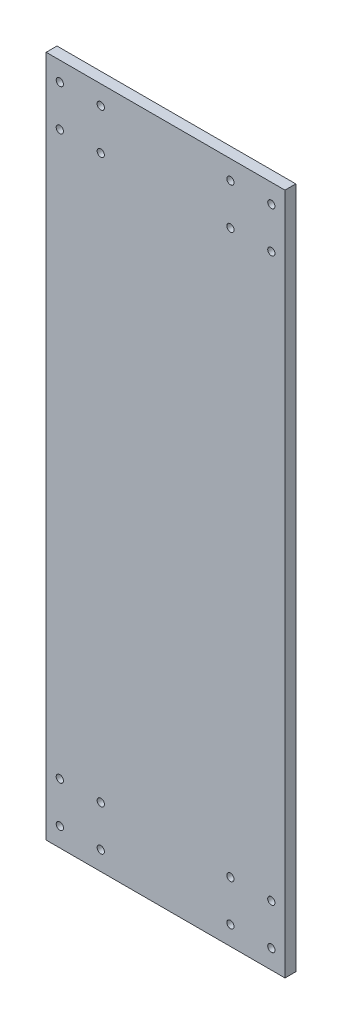
ISO-10303-21;
HEADER;
FILE_DESCRIPTION(('STEP AP214'),'2;1');
FILE_NAME('part.step','',(''),(''),'','','');
FILE_SCHEMA(('AUTOMOTIVE_DESIGN { 1 0 10303 214 1 1 1 1 }'));
ENDSEC;
DATA;
#1=APPLICATION_CONTEXT('core data for automotive mechanical design processes');
#2=APPLICATION_PROTOCOL_DEFINITION('international standard','automotive_design',2000,#1);
#3=PRODUCT_CONTEXT('',#1,'mechanical');
#4=PRODUCT('Part','Part','',(#3));
#5=PRODUCT_RELATED_PRODUCT_CATEGORY('part','',(#4));
#6=PRODUCT_DEFINITION_FORMATION('','',#4);
#7=PRODUCT_DEFINITION_CONTEXT('part definition',#1,'design');
#8=PRODUCT_DEFINITION('design','',#6,#7);
#9=PRODUCT_DEFINITION_SHAPE('','',#8);
#10=(LENGTH_UNIT() NAMED_UNIT(*) SI_UNIT(.MILLI.,.METRE.));
#11=(NAMED_UNIT(*) PLANE_ANGLE_UNIT() SI_UNIT($,.RADIAN.));
#12=(NAMED_UNIT(*) SI_UNIT($,.STERADIAN.) SOLID_ANGLE_UNIT());
#13=UNCERTAINTY_MEASURE_WITH_UNIT(LENGTH_MEASURE(1.E-05),#10,'distance_accuracy_value','');
#14=(GEOMETRIC_REPRESENTATION_CONTEXT(3) GLOBAL_UNCERTAINTY_ASSIGNED_CONTEXT((#13)) GLOBAL_UNIT_ASSIGNED_CONTEXT((#10,
#11,#12)) REPRESENTATION_CONTEXT('',''));
#15=CARTESIAN_POINT('',(0.,0.,0.));
#16=DIRECTION('',(0.,0.,1.));
#17=DIRECTION('',(1.,0.,0.));
#18=AXIS2_PLACEMENT_3D('',#15,#16,#17);
#19=CARTESIAN_POINT('',(0.,0.,6.35));
#20=DIRECTION('',(0.,0.,-1.));
#21=DIRECTION('',(-1.,0.,0.));
#22=AXIS2_PLACEMENT_3D('',#19,#20,#21);
#23=PLANE('',#22);
#24=DIRECTION('',(0.,1.,0.));
#25=VECTOR('',#24,1.);
#26=CARTESIAN_POINT('',(70.,-200.,6.35));
#27=LINE('',#26,#25);
#28=CARTESIAN_POINT('',(70.,-200.,6.35));
#29=VERTEX_POINT('',#28);
#30=CARTESIAN_POINT('',(70.,200.,6.35));
#31=VERTEX_POINT('',#30);
#32=EDGE_CURVE('E95',#29,#31,#27,.T.);
#33=ORIENTED_EDGE('',*,*,#32,.T.);
#34=DIRECTION('',(-1.,0.,0.));
#35=VECTOR('',#34,1.);
#36=CARTESIAN_POINT('',(-70.,200.,6.35));
#37=LINE('',#36,#35);
#38=CARTESIAN_POINT('',(-70.,200.,6.35));
#39=VERTEX_POINT('',#38);
#40=EDGE_CURVE('E90',#31,#39,#37,.T.);
#41=ORIENTED_EDGE('',*,*,#40,.T.);
#42=DIRECTION('',(0.,-1.,0.));
#43=VECTOR('',#42,1.);
#44=CARTESIAN_POINT('',(-70.,-200.,6.35));
#45=LINE('',#44,#43);
#46=CARTESIAN_POINT('',(-70.,-200.,6.35));
#47=VERTEX_POINT('',#46);
#48=EDGE_CURVE('E93',#39,#47,#45,.T.);
#49=ORIENTED_EDGE('',*,*,#48,.T.);
#50=DIRECTION('',(1.,0.,0.));
#51=VECTOR('',#50,1.);
#52=CARTESIAN_POINT('',(-70.,-200.,6.35));
#53=LINE('',#52,#51);
#54=EDGE_CURVE('E60',#47,#29,#53,.T.);
#55=ORIENTED_EDGE('',*,*,#54,.T.);
#56=EDGE_LOOP('',(#33,#41,#49,#55));
#57=FACE_BOUND('',#56,.T.);
#58=CARTESIAN_POINT('',(-62.,188.825,6.35));
#59=DIRECTION('',(0.,0.,1.));
#60=DIRECTION('',(1.,0.,0.));
#61=AXIS2_PLACEMENT_3D('',#58,#59,#60);
#62=CIRCLE('',#61,2.125);
#63=CARTESIAN_POINT('',(-59.875,188.825,6.35));
#64=VERTEX_POINT('',#63);
#65=EDGE_CURVE('E110',#64,#64,#62,.T.);
#66=ORIENTED_EDGE('',*,*,#65,.F.);
#67=EDGE_LOOP('',(#66));
#68=FACE_BOUND('',#67,.T.);
#69=CARTESIAN_POINT('',(-38.,188.825,6.35));
#70=DIRECTION('',(0.,0.,1.));
#71=DIRECTION('',(-1.,0.,0.));
#72=AXIS2_PLACEMENT_3D('',#69,#70,#71);
#73=CIRCLE('',#72,2.125);
#74=CARTESIAN_POINT('',(-40.125,188.825,6.35));
#75=VERTEX_POINT('',#74);
#76=EDGE_CURVE('E125',#75,#75,#73,.T.);
#77=ORIENTED_EDGE('',*,*,#76,.F.);
#78=EDGE_LOOP('',(#77));
#79=FACE_BOUND('',#78,.T.);
#80=CARTESIAN_POINT('',(-38.,164.825,6.35));
#81=DIRECTION('',(0.,0.,1.));
#82=DIRECTION('',(1.,0.,0.));
#83=AXIS2_PLACEMENT_3D('',#80,#81,#82);
#84=CIRCLE('',#83,2.125);
#85=CARTESIAN_POINT('',(-35.875,164.825,6.35));
#86=VERTEX_POINT('',#85);
#87=EDGE_CURVE('E131',#86,#86,#84,.T.);
#88=ORIENTED_EDGE('',*,*,#87,.F.);
#89=EDGE_LOOP('',(#88));
#90=FACE_BOUND('',#89,.T.);
#91=CARTESIAN_POINT('',(-62.,164.825,6.35));
#92=DIRECTION('',(0.,0.,1.));
#93=DIRECTION('',(-1.,0.,0.));
#94=AXIS2_PLACEMENT_3D('',#91,#92,#93);
#95=CIRCLE('',#94,2.125);
#96=CARTESIAN_POINT('',(-64.125,164.825,6.35));
#97=VERTEX_POINT('',#96);
#98=EDGE_CURVE('E137',#97,#97,#95,.T.);
#99=ORIENTED_EDGE('',*,*,#98,.F.);
#100=EDGE_LOOP('',(#99));
#101=FACE_BOUND('',#100,.T.);
#102=CARTESIAN_POINT('',(38.,164.825,6.35));
#103=DIRECTION('',(0.,0.,1.));
#104=DIRECTION('',(-1.,0.,0.));
#105=AXIS2_PLACEMENT_3D('',#102,#103,#104);
#106=CIRCLE('',#105,2.125);
#107=CARTESIAN_POINT('',(35.875,164.825,6.35));
#108=VERTEX_POINT('',#107);
#109=EDGE_CURVE('E143',#108,#108,#106,.T.);
#110=ORIENTED_EDGE('',*,*,#109,.F.);
#111=EDGE_LOOP('',(#110));
#112=FACE_BOUND('',#111,.T.);
#113=CARTESIAN_POINT('',(62.,164.825,6.35));
#114=DIRECTION('',(0.,0.,1.));
#115=DIRECTION('',(1.,0.,0.));
#116=AXIS2_PLACEMENT_3D('',#113,#114,#115);
#117=CIRCLE('',#116,2.12500000000001);
#118=CARTESIAN_POINT('',(64.125,164.825,6.35));
#119=VERTEX_POINT('',#118);
#120=EDGE_CURVE('E149',#119,#119,#117,.T.);
#121=ORIENTED_EDGE('',*,*,#120,.F.);
#122=EDGE_LOOP('',(#121));
#123=FACE_BOUND('',#122,.T.);
#124=CARTESIAN_POINT('',(38.,188.825,6.35));
#125=DIRECTION('',(0.,0.,1.));
#126=DIRECTION('',(1.,0.,0.));
#127=AXIS2_PLACEMENT_3D('',#124,#125,#126);
#128=CIRCLE('',#127,2.125);
#129=CARTESIAN_POINT('',(40.125,188.825,6.35));
#130=VERTEX_POINT('',#129);
#131=EDGE_CURVE('E155',#130,#130,#128,.T.);
#132=ORIENTED_EDGE('',*,*,#131,.F.);
#133=EDGE_LOOP('',(#132));
#134=FACE_BOUND('',#133,.T.);
#135=CARTESIAN_POINT('',(62.,188.825,6.35));
#136=DIRECTION('',(0.,0.,1.));
#137=DIRECTION('',(-1.,0.,0.));
#138=AXIS2_PLACEMENT_3D('',#135,#136,#137);
#139=CIRCLE('',#138,2.12500000000001);
#140=CARTESIAN_POINT('',(59.875,188.825,6.35));
#141=VERTEX_POINT('',#140);
#142=EDGE_CURVE('E161',#141,#141,#139,.T.);
#143=ORIENTED_EDGE('',*,*,#142,.F.);
#144=EDGE_LOOP('',(#143));
#145=FACE_BOUND('',#144,.T.);
#146=CARTESIAN_POINT('',(62.,-188.825,6.35));
#147=DIRECTION('',(0.,0.,1.));
#148=DIRECTION('',(1.,0.,0.));
#149=AXIS2_PLACEMENT_3D('',#146,#147,#148);
#150=CIRCLE('',#149,2.12500000000001);
#151=CARTESIAN_POINT('',(64.125,-188.825,6.35));
#152=VERTEX_POINT('',#151);
#153=EDGE_CURVE('E167',#152,#152,#150,.T.);
#154=ORIENTED_EDGE('',*,*,#153,.F.);
#155=EDGE_LOOP('',(#154));
#156=FACE_BOUND('',#155,.T.);
#157=CARTESIAN_POINT('',(38.,-188.825,6.35));
#158=DIRECTION('',(0.,0.,1.));
#159=DIRECTION('',(-1.,0.,0.));
#160=AXIS2_PLACEMENT_3D('',#157,#158,#159);
#161=CIRCLE('',#160,2.125);
#162=CARTESIAN_POINT('',(35.875,-188.825,6.35));
#163=VERTEX_POINT('',#162);
#164=EDGE_CURVE('E173',#163,#163,#161,.T.);
#165=ORIENTED_EDGE('',*,*,#164,.F.);
#166=EDGE_LOOP('',(#165));
#167=FACE_BOUND('',#166,.T.);
#168=CARTESIAN_POINT('',(62.,-164.825,6.35));
#169=DIRECTION('',(0.,0.,1.));
#170=DIRECTION('',(-1.,0.,0.));
#171=AXIS2_PLACEMENT_3D('',#168,#169,#170);
#172=CIRCLE('',#171,2.12500000000001);
#173=CARTESIAN_POINT('',(59.875,-164.825,6.35));
#174=VERTEX_POINT('',#173);
#175=EDGE_CURVE('E179',#174,#174,#172,.T.);
#176=ORIENTED_EDGE('',*,*,#175,.F.);
#177=EDGE_LOOP('',(#176));
#178=FACE_BOUND('',#177,.T.);
#179=CARTESIAN_POINT('',(38.,-164.825,6.35));
#180=DIRECTION('',(0.,0.,1.));
#181=DIRECTION('',(1.,0.,0.));
#182=AXIS2_PLACEMENT_3D('',#179,#180,#181);
#183=CIRCLE('',#182,2.125);
#184=CARTESIAN_POINT('',(40.125,-164.825,6.35));
#185=VERTEX_POINT('',#184);
#186=EDGE_CURVE('E185',#185,#185,#183,.T.);
#187=ORIENTED_EDGE('',*,*,#186,.F.);
#188=EDGE_LOOP('',(#187));
#189=FACE_BOUND('',#188,.T.);
#190=CARTESIAN_POINT('',(-62.,-164.825,6.35));
#191=DIRECTION('',(0.,0.,1.));
#192=DIRECTION('',(1.,0.,0.));
#193=AXIS2_PLACEMENT_3D('',#190,#191,#192);
#194=CIRCLE('',#193,2.125);
#195=CARTESIAN_POINT('',(-59.875,-164.825,6.35));
#196=VERTEX_POINT('',#195);
#197=EDGE_CURVE('E191',#196,#196,#194,.T.);
#198=ORIENTED_EDGE('',*,*,#197,.F.);
#199=EDGE_LOOP('',(#198));
#200=FACE_BOUND('',#199,.T.);
#201=CARTESIAN_POINT('',(-38.,-164.825,6.35));
#202=DIRECTION('',(0.,0.,1.));
#203=DIRECTION('',(-1.,0.,0.));
#204=AXIS2_PLACEMENT_3D('',#201,#202,#203);
#205=CIRCLE('',#204,2.125);
#206=CARTESIAN_POINT('',(-40.125,-164.825,6.35));
#207=VERTEX_POINT('',#206);
#208=EDGE_CURVE('E197',#207,#207,#205,.T.);
#209=ORIENTED_EDGE('',*,*,#208,.F.);
#210=EDGE_LOOP('',(#209));
#211=FACE_BOUND('',#210,.T.);
#212=CARTESIAN_POINT('',(-38.,-188.825,6.35));
#213=DIRECTION('',(0.,0.,1.));
#214=DIRECTION('',(1.,0.,0.));
#215=AXIS2_PLACEMENT_3D('',#212,#213,#214);
#216=CIRCLE('',#215,2.125);
#217=CARTESIAN_POINT('',(-35.875,-188.825,6.35));
#218=VERTEX_POINT('',#217);
#219=EDGE_CURVE('E203',#218,#218,#216,.T.);
#220=ORIENTED_EDGE('',*,*,#219,.F.);
#221=EDGE_LOOP('',(#220));
#222=FACE_BOUND('',#221,.T.);
#223=CARTESIAN_POINT('',(-62.,-188.825,6.35));
#224=DIRECTION('',(0.,0.,1.));
#225=DIRECTION('',(-1.,0.,0.));
#226=AXIS2_PLACEMENT_3D('',#223,#224,#225);
#227=CIRCLE('',#226,2.125);
#228=CARTESIAN_POINT('',(-64.125,-188.825,6.35));
#229=VERTEX_POINT('',#228);
#230=EDGE_CURVE('E209',#229,#229,#227,.T.);
#231=ORIENTED_EDGE('',*,*,#230,.F.);
#232=EDGE_LOOP('',(#231));
#233=FACE_BOUND('',#232,.T.);
#234=ADVANCED_FACE('F43',(#57,#68,#79,#90,#101,#112,#123,#134,#145,#156,#167,#178,#189,#200,
#211,#222,#233),#23,.F.);
#235=CARTESIAN_POINT('',(0.,0.,0.));
#236=DIRECTION('',(0.,0.,-1.));
#237=DIRECTION('',(-1.,0.,0.));
#238=AXIS2_PLACEMENT_3D('',#235,#236,#237);
#239=PLANE('',#238);
#240=CARTESIAN_POINT('',(-38.,-188.825,0.));
#241=DIRECTION('',(0.,0.,1.));
#242=DIRECTION('',(1.,0.,0.));
#243=AXIS2_PLACEMENT_3D('',#240,#241,#242);
#244=CIRCLE('',#243,2.125);
#245=CARTESIAN_POINT('',(-35.875,-188.825,0.));
#246=VERTEX_POINT('',#245);
#247=EDGE_CURVE('E206',#246,#246,#244,.T.);
#248=ORIENTED_EDGE('',*,*,#247,.T.);
#249=EDGE_LOOP('',(#248));
#250=FACE_BOUND('',#249,.T.);
#251=CARTESIAN_POINT('',(-62.,-164.825,0.));
#252=DIRECTION('',(0.,0.,1.));
#253=DIRECTION('',(1.,0.,0.));
#254=AXIS2_PLACEMENT_3D('',#251,#252,#253);
#255=CIRCLE('',#254,2.125);
#256=CARTESIAN_POINT('',(-59.875,-164.825,0.));
#257=VERTEX_POINT('',#256);
#258=EDGE_CURVE('E194',#257,#257,#255,.T.);
#259=ORIENTED_EDGE('',*,*,#258,.T.);
#260=EDGE_LOOP('',(#259));
#261=FACE_BOUND('',#260,.T.);
#262=CARTESIAN_POINT('',(62.,-164.825,0.));
#263=DIRECTION('',(0.,0.,1.));
#264=DIRECTION('',(-1.,0.,0.));
#265=AXIS2_PLACEMENT_3D('',#262,#263,#264);
#266=CIRCLE('',#265,2.12500000000001);
#267=CARTESIAN_POINT('',(59.875,-164.825,0.));
#268=VERTEX_POINT('',#267);
#269=EDGE_CURVE('E182',#268,#268,#266,.T.);
#270=ORIENTED_EDGE('',*,*,#269,.T.);
#271=EDGE_LOOP('',(#270));
#272=FACE_BOUND('',#271,.T.);
#273=CARTESIAN_POINT('',(62.,-188.825,0.));
#274=DIRECTION('',(0.,0.,1.));
#275=DIRECTION('',(1.,0.,0.));
#276=AXIS2_PLACEMENT_3D('',#273,#274,#275);
#277=CIRCLE('',#276,2.12500000000001);
#278=CARTESIAN_POINT('',(64.125,-188.825,0.));
#279=VERTEX_POINT('',#278);
#280=EDGE_CURVE('E170',#279,#279,#277,.T.);
#281=ORIENTED_EDGE('',*,*,#280,.T.);
#282=EDGE_LOOP('',(#281));
#283=FACE_BOUND('',#282,.T.);
#284=CARTESIAN_POINT('',(38.,188.825,0.));
#285=DIRECTION('',(0.,0.,1.));
#286=DIRECTION('',(1.,0.,0.));
#287=AXIS2_PLACEMENT_3D('',#284,#285,#286);
#288=CIRCLE('',#287,2.125);
#289=CARTESIAN_POINT('',(40.125,188.825,0.));
#290=VERTEX_POINT('',#289);
#291=EDGE_CURVE('E158',#290,#290,#288,.T.);
#292=ORIENTED_EDGE('',*,*,#291,.T.);
#293=EDGE_LOOP('',(#292));
#294=FACE_BOUND('',#293,.T.);
#295=CARTESIAN_POINT('',(38.,164.825,0.));
#296=DIRECTION('',(0.,0.,1.));
#297=DIRECTION('',(-1.,0.,0.));
#298=AXIS2_PLACEMENT_3D('',#295,#296,#297);
#299=CIRCLE('',#298,2.125);
#300=CARTESIAN_POINT('',(35.875,164.825,0.));
#301=VERTEX_POINT('',#300);
#302=EDGE_CURVE('E146',#301,#301,#299,.T.);
#303=ORIENTED_EDGE('',*,*,#302,.T.);
#304=EDGE_LOOP('',(#303));
#305=FACE_BOUND('',#304,.T.);
#306=CARTESIAN_POINT('',(-38.,164.825,0.));
#307=DIRECTION('',(0.,0.,1.));
#308=DIRECTION('',(1.,0.,0.));
#309=AXIS2_PLACEMENT_3D('',#306,#307,#308);
#310=CIRCLE('',#309,2.125);
#311=CARTESIAN_POINT('',(-35.875,164.825,0.));
#312=VERTEX_POINT('',#311);
#313=EDGE_CURVE('E134',#312,#312,#310,.T.);
#314=ORIENTED_EDGE('',*,*,#313,.T.);
#315=EDGE_LOOP('',(#314));
#316=FACE_BOUND('',#315,.T.);
#317=CARTESIAN_POINT('',(-62.,188.825,0.));
#318=DIRECTION('',(0.,0.,1.));
#319=DIRECTION('',(1.,0.,0.));
#320=AXIS2_PLACEMENT_3D('',#317,#318,#319);
#321=CIRCLE('',#320,2.125);
#322=CARTESIAN_POINT('',(-59.875,188.825,0.));
#323=VERTEX_POINT('',#322);
#324=EDGE_CURVE('E122',#323,#323,#321,.T.);
#325=ORIENTED_EDGE('',*,*,#324,.T.);
#326=EDGE_LOOP('',(#325));
#327=FACE_BOUND('',#326,.T.);
#328=DIRECTION('',(0.,1.,0.));
#329=VECTOR('',#328,1.);
#330=CARTESIAN_POINT('',(70.,-200.,0.));
#331=LINE('',#330,#329);
#332=CARTESIAN_POINT('',(70.,-200.,0.));
#333=VERTEX_POINT('',#332);
#334=CARTESIAN_POINT('',(70.,200.,0.));
#335=VERTEX_POINT('',#334);
#336=EDGE_CURVE('E107',#333,#335,#331,.T.);
#337=ORIENTED_EDGE('',*,*,#336,.F.);
#338=DIRECTION('',(1.,0.,0.));
#339=VECTOR('',#338,1.);
#340=CARTESIAN_POINT('',(-70.,-200.,0.));
#341=LINE('',#340,#339);
#342=CARTESIAN_POINT('',(-70.,-200.,0.));
#343=VERTEX_POINT('',#342);
#344=EDGE_CURVE('E83',#343,#333,#341,.T.);
#345=ORIENTED_EDGE('',*,*,#344,.F.);
#346=DIRECTION('',(0.,-1.,0.));
#347=VECTOR('',#346,1.);
#348=CARTESIAN_POINT('',(-70.,-200.,0.));
#349=LINE('',#348,#347);
#350=CARTESIAN_POINT('',(-70.,200.,0.));
#351=VERTEX_POINT('',#350);
#352=EDGE_CURVE('E77',#351,#343,#349,.T.);
#353=ORIENTED_EDGE('',*,*,#352,.F.);
#354=DIRECTION('',(-1.,0.,0.));
#355=VECTOR('',#354,1.);
#356=CARTESIAN_POINT('',(-70.,200.,0.));
#357=LINE('',#356,#355);
#358=EDGE_CURVE('E99',#335,#351,#357,.T.);
#359=ORIENTED_EDGE('',*,*,#358,.F.);
#360=EDGE_LOOP('',(#337,#345,#353,#359));
#361=FACE_BOUND('',#360,.T.);
#362=CARTESIAN_POINT('',(-38.,188.825,0.));
#363=DIRECTION('',(0.,0.,1.));
#364=DIRECTION('',(-1.,0.,0.));
#365=AXIS2_PLACEMENT_3D('',#362,#363,#364);
#366=CIRCLE('',#365,2.125);
#367=CARTESIAN_POINT('',(-40.125,188.825,0.));
#368=VERTEX_POINT('',#367);
#369=EDGE_CURVE('E128',#368,#368,#366,.T.);
#370=ORIENTED_EDGE('',*,*,#369,.T.);
#371=EDGE_LOOP('',(#370));
#372=FACE_BOUND('',#371,.T.);
#373=CARTESIAN_POINT('',(-62.,164.825,0.));
#374=DIRECTION('',(0.,0.,1.));
#375=DIRECTION('',(-1.,0.,0.));
#376=AXIS2_PLACEMENT_3D('',#373,#374,#375);
#377=CIRCLE('',#376,2.125);
#378=CARTESIAN_POINT('',(-64.125,164.825,0.));
#379=VERTEX_POINT('',#378);
#380=EDGE_CURVE('E140',#379,#379,#377,.T.);
#381=ORIENTED_EDGE('',*,*,#380,.T.);
#382=EDGE_LOOP('',(#381));
#383=FACE_BOUND('',#382,.T.);
#384=CARTESIAN_POINT('',(62.,164.825,0.));
#385=DIRECTION('',(0.,0.,1.));
#386=DIRECTION('',(1.,0.,0.));
#387=AXIS2_PLACEMENT_3D('',#384,#385,#386);
#388=CIRCLE('',#387,2.12500000000001);
#389=CARTESIAN_POINT('',(64.125,164.825,0.));
#390=VERTEX_POINT('',#389);
#391=EDGE_CURVE('E152',#390,#390,#388,.T.);
#392=ORIENTED_EDGE('',*,*,#391,.T.);
#393=EDGE_LOOP('',(#392));
#394=FACE_BOUND('',#393,.T.);
#395=CARTESIAN_POINT('',(62.,188.825,0.));
#396=DIRECTION('',(0.,0.,1.));
#397=DIRECTION('',(-1.,0.,0.));
#398=AXIS2_PLACEMENT_3D('',#395,#396,#397);
#399=CIRCLE('',#398,2.12500000000001);
#400=CARTESIAN_POINT('',(59.875,188.825,0.));
#401=VERTEX_POINT('',#400);
#402=EDGE_CURVE('E164',#401,#401,#399,.T.);
#403=ORIENTED_EDGE('',*,*,#402,.T.);
#404=EDGE_LOOP('',(#403));
#405=FACE_BOUND('',#404,.T.);
#406=CARTESIAN_POINT('',(38.,-188.825,0.));
#407=DIRECTION('',(0.,0.,1.));
#408=DIRECTION('',(-1.,0.,0.));
#409=AXIS2_PLACEMENT_3D('',#406,#407,#408);
#410=CIRCLE('',#409,2.125);
#411=CARTESIAN_POINT('',(35.875,-188.825,0.));
#412=VERTEX_POINT('',#411);
#413=EDGE_CURVE('E176',#412,#412,#410,.T.);
#414=ORIENTED_EDGE('',*,*,#413,.T.);
#415=EDGE_LOOP('',(#414));
#416=FACE_BOUND('',#415,.T.);
#417=CARTESIAN_POINT('',(38.,-164.825,0.));
#418=DIRECTION('',(0.,0.,1.));
#419=DIRECTION('',(1.,0.,0.));
#420=AXIS2_PLACEMENT_3D('',#417,#418,#419);
#421=CIRCLE('',#420,2.125);
#422=CARTESIAN_POINT('',(40.125,-164.825,0.));
#423=VERTEX_POINT('',#422);
#424=EDGE_CURVE('E188',#423,#423,#421,.T.);
#425=ORIENTED_EDGE('',*,*,#424,.T.);
#426=EDGE_LOOP('',(#425));
#427=FACE_BOUND('',#426,.T.);
#428=CARTESIAN_POINT('',(-38.,-164.825,0.));
#429=DIRECTION('',(0.,0.,1.));
#430=DIRECTION('',(-1.,0.,0.));
#431=AXIS2_PLACEMENT_3D('',#428,#429,#430);
#432=CIRCLE('',#431,2.125);
#433=CARTESIAN_POINT('',(-40.125,-164.825,0.));
#434=VERTEX_POINT('',#433);
#435=EDGE_CURVE('E200',#434,#434,#432,.T.);
#436=ORIENTED_EDGE('',*,*,#435,.T.);
#437=EDGE_LOOP('',(#436));
#438=FACE_BOUND('',#437,.T.);
#439=CARTESIAN_POINT('',(-62.,-188.825,0.));
#440=DIRECTION('',(0.,0.,1.));
#441=DIRECTION('',(-1.,0.,0.));
#442=AXIS2_PLACEMENT_3D('',#439,#440,#441);
#443=CIRCLE('',#442,2.125);
#444=CARTESIAN_POINT('',(-64.125,-188.825,0.));
#445=VERTEX_POINT('',#444);
#446=EDGE_CURVE('E212',#445,#445,#443,.T.);
#447=ORIENTED_EDGE('',*,*,#446,.T.);
#448=EDGE_LOOP('',(#447));
#449=FACE_BOUND('',#448,.T.);
#450=ADVANCED_FACE('F118',(#250,#261,#272,#283,#294,#305,#316,#327,#361,#372,#383,#394,#405,
#416,#427,#438,#449),#239,.T.);
#451=CARTESIAN_POINT('',(70.,-200.,6.35));
#452=DIRECTION('',(-1.,0.,0.));
#453=DIRECTION('',(0.,0.,1.));
#454=AXIS2_PLACEMENT_3D('',#451,#452,#453);
#455=PLANE('',#454);
#456=ORIENTED_EDGE('',*,*,#336,.T.);
#457=DIRECTION('',(0.,0.,-1.));
#458=VECTOR('',#457,1.);
#459=CARTESIAN_POINT('',(70.,200.,6.35));
#460=LINE('',#459,#458);
#461=EDGE_CURVE('E11',#31,#335,#460,.T.);
#462=ORIENTED_EDGE('',*,*,#461,.F.);
#463=ORIENTED_EDGE('',*,*,#32,.F.);
#464=DIRECTION('',(0.,0.,-1.));
#465=VECTOR('',#464,1.);
#466=CARTESIAN_POINT('',(70.,-200.,6.35));
#467=LINE('',#466,#465);
#468=EDGE_CURVE('E103',#29,#333,#467,.T.);
#469=ORIENTED_EDGE('',*,*,#468,.T.);
#470=EDGE_LOOP('',(#456,#462,#463,#469));
#471=FACE_BOUND('',#470,.T.);
#472=ADVANCED_FACE('F45',(#471),#455,.F.);
#473=CARTESIAN_POINT('',(-70.,200.,6.35));
#474=DIRECTION('',(0.,-1.,0.));
#475=DIRECTION('',(0.,0.,-1.));
#476=AXIS2_PLACEMENT_3D('',#473,#474,#475);
#477=PLANE('',#476);
#478=ORIENTED_EDGE('',*,*,#358,.T.);
#479=DIRECTION('',(0.,0.,-1.));
#480=VECTOR('',#479,1.);
#481=CARTESIAN_POINT('',(-70.,200.,6.35));
#482=LINE('',#481,#480);
#483=EDGE_CURVE('E52',#39,#351,#482,.T.);
#484=ORIENTED_EDGE('',*,*,#483,.F.);
#485=ORIENTED_EDGE('',*,*,#40,.F.);
#486=ORIENTED_EDGE('',*,*,#461,.T.);
#487=EDGE_LOOP('',(#478,#484,#485,#486));
#488=FACE_BOUND('',#487,.T.);
#489=ADVANCED_FACE('F98',(#488),#477,.F.);
#490=CARTESIAN_POINT('',(-70.,-200.,6.35));
#491=DIRECTION('',(1.,0.,0.));
#492=DIRECTION('',(0.,0.,-1.));
#493=AXIS2_PLACEMENT_3D('',#490,#491,#492);
#494=PLANE('',#493);
#495=ORIENTED_EDGE('',*,*,#352,.T.);
#496=DIRECTION('',(0.,0.,-1.));
#497=VECTOR('',#496,1.);
#498=CARTESIAN_POINT('',(-70.,-200.,6.35));
#499=LINE('',#498,#497);
#500=EDGE_CURVE('E100',#47,#343,#499,.T.);
#501=ORIENTED_EDGE('',*,*,#500,.F.);
#502=ORIENTED_EDGE('',*,*,#48,.F.);
#503=ORIENTED_EDGE('',*,*,#483,.T.);
#504=EDGE_LOOP('',(#495,#501,#502,#503));
#505=FACE_BOUND('',#504,.T.);
#506=ADVANCED_FACE('F101',(#505),#494,.F.);
#507=CARTESIAN_POINT('',(-70.,-200.,6.35));
#508=DIRECTION('',(0.,1.,0.));
#509=DIRECTION('',(0.,0.,1.));
#510=AXIS2_PLACEMENT_3D('',#507,#508,#509);
#511=PLANE('',#510);
#512=ORIENTED_EDGE('',*,*,#344,.T.);
#513=ORIENTED_EDGE('',*,*,#468,.F.);
#514=ORIENTED_EDGE('',*,*,#54,.F.);
#515=ORIENTED_EDGE('',*,*,#500,.T.);
#516=EDGE_LOOP('',(#512,#513,#514,#515));
#517=FACE_BOUND('',#516,.T.);
#518=ADVANCED_FACE('F115',(#517),#511,.F.);
#519=CARTESIAN_POINT('',(-62.,188.825,6.35));
#520=DIRECTION('',(0.,0.,-1.));
#521=DIRECTION('',(-1.,0.,0.));
#522=AXIS2_PLACEMENT_3D('',#519,#520,#521);
#523=CYLINDRICAL_SURFACE('',#522,2.125);
#524=ORIENTED_EDGE('',*,*,#65,.T.);
#525=EDGE_LOOP('',(#524));
#526=FACE_BOUND('',#525,.T.);
#527=ORIENTED_EDGE('',*,*,#324,.F.);
#528=EDGE_LOOP('',(#527));
#529=FACE_BOUND('',#528,.T.);
#530=ADVANCED_FACE('F229',(#526,#529),#523,.F.);
#531=CARTESIAN_POINT('',(-38.,188.825,6.35));
#532=DIRECTION('',(0.,0.,-1.));
#533=DIRECTION('',(-1.,0.,0.));
#534=AXIS2_PLACEMENT_3D('',#531,#532,#533);
#535=CYLINDRICAL_SURFACE('',#534,2.125);
#536=ORIENTED_EDGE('',*,*,#76,.T.);
#537=EDGE_LOOP('',(#536));
#538=FACE_BOUND('',#537,.T.);
#539=ORIENTED_EDGE('',*,*,#369,.F.);
#540=EDGE_LOOP('',(#539));
#541=FACE_BOUND('',#540,.T.);
#542=ADVANCED_FACE('F274',(#538,#541),#535,.F.);
#543=CARTESIAN_POINT('',(-38.,164.825,6.35));
#544=DIRECTION('',(0.,0.,-1.));
#545=DIRECTION('',(-1.,0.,0.));
#546=AXIS2_PLACEMENT_3D('',#543,#544,#545);
#547=CYLINDRICAL_SURFACE('',#546,2.125);
#548=ORIENTED_EDGE('',*,*,#87,.T.);
#549=EDGE_LOOP('',(#548));
#550=FACE_BOUND('',#549,.T.);
#551=ORIENTED_EDGE('',*,*,#313,.F.);
#552=EDGE_LOOP('',(#551));
#553=FACE_BOUND('',#552,.T.);
#554=ADVANCED_FACE('F282',(#550,#553),#547,.F.);
#555=CARTESIAN_POINT('',(-62.,164.825,6.35));
#556=DIRECTION('',(0.,0.,-1.));
#557=DIRECTION('',(-1.,0.,0.));
#558=AXIS2_PLACEMENT_3D('',#555,#556,#557);
#559=CYLINDRICAL_SURFACE('',#558,2.125);
#560=ORIENTED_EDGE('',*,*,#98,.T.);
#561=EDGE_LOOP('',(#560));
#562=FACE_BOUND('',#561,.T.);
#563=ORIENTED_EDGE('',*,*,#380,.F.);
#564=EDGE_LOOP('',(#563));
#565=FACE_BOUND('',#564,.T.);
#566=ADVANCED_FACE('F290',(#562,#565),#559,.F.);
#567=CARTESIAN_POINT('',(38.,164.825,6.35));
#568=DIRECTION('',(0.,0.,-1.));
#569=DIRECTION('',(-1.,0.,0.));
#570=AXIS2_PLACEMENT_3D('',#567,#568,#569);
#571=CYLINDRICAL_SURFACE('',#570,2.125);
#572=ORIENTED_EDGE('',*,*,#109,.T.);
#573=EDGE_LOOP('',(#572));
#574=FACE_BOUND('',#573,.T.);
#575=ORIENTED_EDGE('',*,*,#302,.F.);
#576=EDGE_LOOP('',(#575));
#577=FACE_BOUND('',#576,.T.);
#578=ADVANCED_FACE('F299',(#574,#577),#571,.F.);
#579=CARTESIAN_POINT('',(62.,164.825,6.35));
#580=DIRECTION('',(0.,0.,-1.));
#581=DIRECTION('',(-1.,0.,0.));
#582=AXIS2_PLACEMENT_3D('',#579,#580,#581);
#583=CYLINDRICAL_SURFACE('',#582,2.12500000000001);
#584=ORIENTED_EDGE('',*,*,#120,.T.);
#585=EDGE_LOOP('',(#584));
#586=FACE_BOUND('',#585,.T.);
#587=ORIENTED_EDGE('',*,*,#391,.F.);
#588=EDGE_LOOP('',(#587));
#589=FACE_BOUND('',#588,.T.);
#590=ADVANCED_FACE('F308',(#586,#589),#583,.F.);
#591=CARTESIAN_POINT('',(38.,188.825,6.35));
#592=DIRECTION('',(0.,0.,-1.));
#593=DIRECTION('',(-1.,0.,0.));
#594=AXIS2_PLACEMENT_3D('',#591,#592,#593);
#595=CYLINDRICAL_SURFACE('',#594,2.125);
#596=ORIENTED_EDGE('',*,*,#131,.T.);
#597=EDGE_LOOP('',(#596));
#598=FACE_BOUND('',#597,.T.);
#599=ORIENTED_EDGE('',*,*,#291,.F.);
#600=EDGE_LOOP('',(#599));
#601=FACE_BOUND('',#600,.T.);
#602=ADVANCED_FACE('F317',(#598,#601),#595,.F.);
#603=CARTESIAN_POINT('',(62.,188.825,6.35));
#604=DIRECTION('',(0.,0.,-1.));
#605=DIRECTION('',(-1.,0.,0.));
#606=AXIS2_PLACEMENT_3D('',#603,#604,#605);
#607=CYLINDRICAL_SURFACE('',#606,2.12500000000001);
#608=ORIENTED_EDGE('',*,*,#142,.T.);
#609=EDGE_LOOP('',(#608));
#610=FACE_BOUND('',#609,.T.);
#611=ORIENTED_EDGE('',*,*,#402,.F.);
#612=EDGE_LOOP('',(#611));
#613=FACE_BOUND('',#612,.T.);
#614=ADVANCED_FACE('F326',(#610,#613),#607,.F.);
#615=CARTESIAN_POINT('',(62.,-188.825,6.35));
#616=DIRECTION('',(0.,0.,-1.));
#617=DIRECTION('',(-1.,0.,0.));
#618=AXIS2_PLACEMENT_3D('',#615,#616,#617);
#619=CYLINDRICAL_SURFACE('',#618,2.12500000000001);
#620=ORIENTED_EDGE('',*,*,#153,.T.);
#621=EDGE_LOOP('',(#620));
#622=FACE_BOUND('',#621,.T.);
#623=ORIENTED_EDGE('',*,*,#280,.F.);
#624=EDGE_LOOP('',(#623));
#625=FACE_BOUND('',#624,.T.);
#626=ADVANCED_FACE('F335',(#622,#625),#619,.F.);
#627=CARTESIAN_POINT('',(38.,-188.825,6.35));
#628=DIRECTION('',(0.,0.,-1.));
#629=DIRECTION('',(-1.,0.,0.));
#630=AXIS2_PLACEMENT_3D('',#627,#628,#629);
#631=CYLINDRICAL_SURFACE('',#630,2.125);
#632=ORIENTED_EDGE('',*,*,#164,.T.);
#633=EDGE_LOOP('',(#632));
#634=FACE_BOUND('',#633,.T.);
#635=ORIENTED_EDGE('',*,*,#413,.F.);
#636=EDGE_LOOP('',(#635));
#637=FACE_BOUND('',#636,.T.);
#638=ADVANCED_FACE('F344',(#634,#637),#631,.F.);
#639=CARTESIAN_POINT('',(62.,-164.825,6.35));
#640=DIRECTION('',(0.,0.,-1.));
#641=DIRECTION('',(-1.,0.,0.));
#642=AXIS2_PLACEMENT_3D('',#639,#640,#641);
#643=CYLINDRICAL_SURFACE('',#642,2.12500000000001);
#644=ORIENTED_EDGE('',*,*,#175,.T.);
#645=EDGE_LOOP('',(#644));
#646=FACE_BOUND('',#645,.T.);
#647=ORIENTED_EDGE('',*,*,#269,.F.);
#648=EDGE_LOOP('',(#647));
#649=FACE_BOUND('',#648,.T.);
#650=ADVANCED_FACE('F353',(#646,#649),#643,.F.);
#651=CARTESIAN_POINT('',(38.,-164.825,6.35));
#652=DIRECTION('',(0.,0.,-1.));
#653=DIRECTION('',(-1.,0.,0.));
#654=AXIS2_PLACEMENT_3D('',#651,#652,#653);
#655=CYLINDRICAL_SURFACE('',#654,2.125);
#656=ORIENTED_EDGE('',*,*,#186,.T.);
#657=EDGE_LOOP('',(#656));
#658=FACE_BOUND('',#657,.T.);
#659=ORIENTED_EDGE('',*,*,#424,.F.);
#660=EDGE_LOOP('',(#659));
#661=FACE_BOUND('',#660,.T.);
#662=ADVANCED_FACE('F362',(#658,#661),#655,.F.);
#663=CARTESIAN_POINT('',(-62.,-164.825,6.35));
#664=DIRECTION('',(0.,0.,-1.));
#665=DIRECTION('',(-1.,0.,0.));
#666=AXIS2_PLACEMENT_3D('',#663,#664,#665);
#667=CYLINDRICAL_SURFACE('',#666,2.125);
#668=ORIENTED_EDGE('',*,*,#197,.T.);
#669=EDGE_LOOP('',(#668));
#670=FACE_BOUND('',#669,.T.);
#671=ORIENTED_EDGE('',*,*,#258,.F.);
#672=EDGE_LOOP('',(#671));
#673=FACE_BOUND('',#672,.T.);
#674=ADVANCED_FACE('F371',(#670,#673),#667,.F.);
#675=CARTESIAN_POINT('',(-38.,-164.825,6.35));
#676=DIRECTION('',(0.,0.,-1.));
#677=DIRECTION('',(-1.,0.,0.));
#678=AXIS2_PLACEMENT_3D('',#675,#676,#677);
#679=CYLINDRICAL_SURFACE('',#678,2.125);
#680=ORIENTED_EDGE('',*,*,#208,.T.);
#681=EDGE_LOOP('',(#680));
#682=FACE_BOUND('',#681,.T.);
#683=ORIENTED_EDGE('',*,*,#435,.F.);
#684=EDGE_LOOP('',(#683));
#685=FACE_BOUND('',#684,.T.);
#686=ADVANCED_FACE('F380',(#682,#685),#679,.F.);
#687=CARTESIAN_POINT('',(-38.,-188.825,6.35));
#688=DIRECTION('',(0.,0.,-1.));
#689=DIRECTION('',(-1.,0.,0.));
#690=AXIS2_PLACEMENT_3D('',#687,#688,#689);
#691=CYLINDRICAL_SURFACE('',#690,2.125);
#692=ORIENTED_EDGE('',*,*,#219,.T.);
#693=EDGE_LOOP('',(#692));
#694=FACE_BOUND('',#693,.T.);
#695=ORIENTED_EDGE('',*,*,#247,.F.);
#696=EDGE_LOOP('',(#695));
#697=FACE_BOUND('',#696,.T.);
#698=ADVANCED_FACE('F389',(#694,#697),#691,.F.);
#699=CARTESIAN_POINT('',(-62.,-188.825,6.35));
#700=DIRECTION('',(0.,0.,-1.));
#701=DIRECTION('',(-1.,0.,0.));
#702=AXIS2_PLACEMENT_3D('',#699,#700,#701);
#703=CYLINDRICAL_SURFACE('',#702,2.125);
#704=ORIENTED_EDGE('',*,*,#230,.T.);
#705=EDGE_LOOP('',(#704));
#706=FACE_BOUND('',#705,.T.);
#707=ORIENTED_EDGE('',*,*,#446,.F.);
#708=EDGE_LOOP('',(#707));
#709=FACE_BOUND('',#708,.T.);
#710=ADVANCED_FACE('F218',(#706,#709),#703,.F.);
#711=CLOSED_SHELL('',(#234,#450,#472,#489,#506,#518,#530,#542,#554,#566,#578,#590,#602,#614,
#626,#638,#650,#662,#674,#686,#698,#710));
#712=MANIFOLD_SOLID_BREP('B2',#711);
#713=ADVANCED_BREP_SHAPE_REPRESENTATION('',(#18,#712),#14);
#714=SHAPE_DEFINITION_REPRESENTATION(#9,#713);
ENDSEC;
END-ISO-10303-21;
